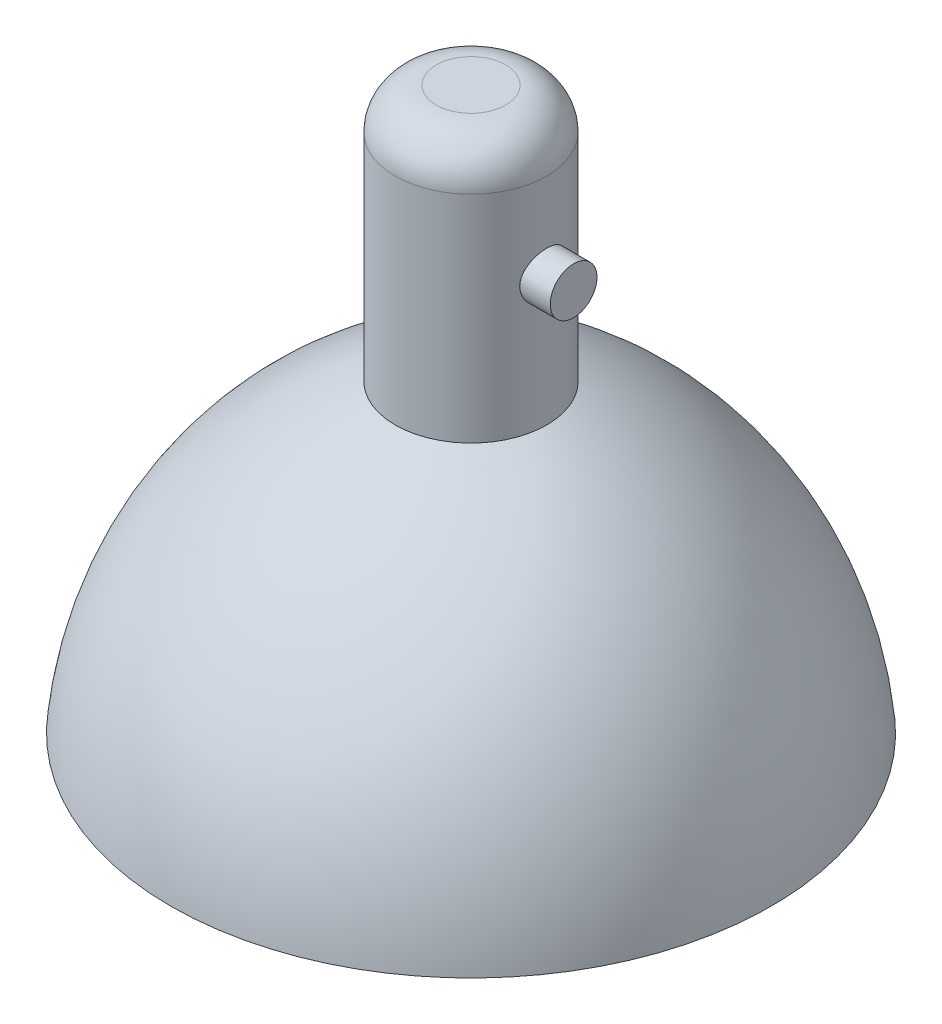
ISO-10303-21;
HEADER;
FILE_DESCRIPTION(('STEP AP214'),'2;1');
FILE_NAME('part.step','',(''),(''),'','','');
FILE_SCHEMA(('AUTOMOTIVE_DESIGN { 1 0 10303 214 1 1 1 1 }'));
ENDSEC;
DATA;
#1=APPLICATION_CONTEXT('core data for automotive mechanical design processes');
#2=APPLICATION_PROTOCOL_DEFINITION('international standard','automotive_design',2000,#1);
#3=PRODUCT_CONTEXT('',#1,'mechanical');
#4=PRODUCT('Part','Part','',(#3));
#5=PRODUCT_RELATED_PRODUCT_CATEGORY('part','',(#4));
#6=PRODUCT_DEFINITION_FORMATION('','',#4);
#7=PRODUCT_DEFINITION_CONTEXT('part definition',#1,'design');
#8=PRODUCT_DEFINITION('design','',#6,#7);
#9=PRODUCT_DEFINITION_SHAPE('','',#8);
#10=(LENGTH_UNIT() NAMED_UNIT(*) SI_UNIT(.MILLI.,.METRE.));
#11=(NAMED_UNIT(*) PLANE_ANGLE_UNIT() SI_UNIT($,.RADIAN.));
#12=(NAMED_UNIT(*) SI_UNIT($,.STERADIAN.) SOLID_ANGLE_UNIT());
#13=UNCERTAINTY_MEASURE_WITH_UNIT(LENGTH_MEASURE(1.E-05),#10,'distance_accuracy_value','');
#14=(GEOMETRIC_REPRESENTATION_CONTEXT(3) GLOBAL_UNCERTAINTY_ASSIGNED_CONTEXT((#13)) GLOBAL_UNIT_ASSIGNED_CONTEXT((#10,
#11,#12)) REPRESENTATION_CONTEXT('',''));
#15=CARTESIAN_POINT('',(0.,0.,0.));
#16=DIRECTION('',(0.,0.,1.));
#17=DIRECTION('',(1.,0.,0.));
#18=AXIS2_PLACEMENT_3D('',#15,#16,#17);
#19=CARTESIAN_POINT('',(0.,54.6759675547388,0.));
#20=DIRECTION('',(0.,-1.,0.));
#21=DIRECTION('',(0.,0.,-1.));
#22=AXIS2_PLACEMENT_3D('',#19,#20,#21);
#23=CYLINDRICAL_SURFACE('',#22,7.38529786260853);
#24=CARTESIAN_POINT('',(0.,50.6759675547388,0.));
#25=DIRECTION('',(0.,1.,0.));
#26=DIRECTION('',(0.,0.,1.));
#27=AXIS2_PLACEMENT_3D('',#24,#25,#26);
#28=CIRCLE('',#27,7.38529786260853);
#29=CARTESIAN_POINT('',(0.,50.6759675547388,7.38529786260853));
#30=VERTEX_POINT('',#29);
#31=EDGE_CURVE('E50',#30,#30,#28,.F.);
#32=ORIENTED_EDGE('',*,*,#31,.T.);
#33=EDGE_LOOP('',(#32));
#34=FACE_BOUND('',#33,.T.);
#35=CARTESIAN_POINT('',(0.,29.6759675547388,0.));
#36=DIRECTION('',(0.,1.,0.));
#37=DIRECTION('',(0.,0.,1.));
#38=AXIS2_PLACEMENT_3D('',#35,#36,#37);
#39=CIRCLE('',#38,7.38529786260853);
#40=CARTESIAN_POINT('',(0.,29.6759675547388,7.38529786260853));
#41=VERTEX_POINT('',#40);
#42=EDGE_CURVE('E71',#41,#41,#39,.T.);
#43=ORIENTED_EDGE('',*,*,#42,.T.);
#44=EDGE_LOOP('',(#43));
#45=FACE_BOUND('',#44,.T.);
#46=CARTESIAN_POINT('',(7.02529154065876,42.3153253212094,2.27769692632679));
#47=CARTESIAN_POINT('',(7.02529249307884,42.1906964600661,2.27769584003234));
#48=CARTESIAN_POINT('',(7.02864420684463,42.0660567736508,2.26743319134466));
#49=CARTESIAN_POINT('',(7.04163155234802,41.820433249435,2.22676730826925));
#50=CARTESIAN_POINT('',(7.05126901359609,41.6994504867381,2.19635821007672));
#51=CARTESIAN_POINT('',(7.07563473496744,41.4647334604111,2.11653972693149));
#52=CARTESIAN_POINT('',(7.09035416261902,41.3509870235713,2.06716329060672));
#53=CARTESIAN_POINT('',(7.12321314218842,41.1333620073075,1.9509211470018));
#54=CARTESIAN_POINT('',(7.14135326809307,41.0294850883758,1.88405250383141));
#55=CARTESIAN_POINT('',(7.17969034858651,40.8310726619195,1.73232861105308));
#56=CARTESIAN_POINT('',(7.19993299643461,40.7369159861496,1.64698938575516));
#57=CARTESIAN_POINT('',(7.23980497837883,40.5639977507854,1.46178292719813));
#58=CARTESIAN_POINT('',(7.25943422882912,40.4852382831984,1.36191372297218));
#59=CARTESIAN_POINT('',(7.29638919587495,40.3436873040599,1.14776897511424));
#60=CARTESIAN_POINT('',(7.31365482555179,40.2812846463807,1.03322511772235));
#61=CARTESIAN_POINT('',(7.34340449292231,40.1767765206975,0.794645290109409));
#62=CARTESIAN_POINT('',(7.35588962354597,40.1346664127886,0.670611497291362));
#63=CARTESIAN_POINT('',(7.37434817010741,40.0731999112992,0.420538145242259));
#64=CARTESIAN_POINT('',(7.38050641088676,40.0531963131506,0.29467155568746));
#65=CARTESIAN_POINT('',(7.38626945636775,40.0344614186492,0.0412280875430184));
#66=CARTESIAN_POINT('',(7.38587571321481,40.0357254086667,-0.0863484058100515));
#67=CARTESIAN_POINT('',(7.37870849528778,40.0590611814491,-0.335040002476932));
#68=CARTESIAN_POINT('',(7.372150065099,40.0804316091325,-0.456228100086667));
#69=CARTESIAN_POINT('',(7.35365383293992,40.14222453281,-0.693205515684735));
#70=CARTESIAN_POINT('',(7.34171568331049,40.1826482601129,-0.808994484225888));
#71=CARTESIAN_POINT('',(7.31350987159478,40.2818589312729,-1.03352122719463));
#72=CARTESIAN_POINT('',(7.29719177586676,40.3408612670583,-1.142157230491));
#73=CARTESIAN_POINT('',(7.26194920696148,40.4753823143304,-1.34820658421934));
#74=CARTESIAN_POINT('',(7.24302408837501,40.5509051184477,-1.44561714461629));
#75=CARTESIAN_POINT('',(7.20367771982453,40.7199363162478,-1.63063380830203));
#76=CARTESIAN_POINT('',(7.18322692404642,40.8140509262846,-1.71768055003003));
#77=CARTESIAN_POINT('',(7.14380079083582,41.0157358826812,-1.87491947495823));
#78=CARTESIAN_POINT('',(7.12482561807302,41.1233077272944,-1.94510977891215));
#79=CARTESIAN_POINT('',(7.0903526945539,41.3503982190635,-2.06727161481833));
#80=CARTESIAN_POINT('',(7.07489409171803,41.4700318019796,-2.11904135292898));
#81=CARTESIAN_POINT('',(7.04966546471577,41.7169091179263,-2.20152752153833));
#82=CARTESIAN_POINT('',(7.03989345973987,41.8441501839952,-2.23225128363161));
#83=CARTESIAN_POINT('',(7.02758249874553,42.0972831296647,-2.27070537448217));
#84=CARTESIAN_POINT('',(7.02477491162088,42.2230322246986,-2.27929018982539));
#85=CARTESIAN_POINT('',(7.02596583445491,42.4741810987061,-2.27561733544798));
#86=CARTESIAN_POINT('',(7.02996332602363,42.599580927135,-2.26336278436929));
#87=CARTESIAN_POINT('',(7.04404928730057,42.8428310837505,-2.21912183914956));
#88=CARTESIAN_POINT('',(7.05396452169051,42.960794446614,-2.18769610177057));
#89=CARTESIAN_POINT('',(7.0785865712683,43.1897625933181,-2.1066603922306));
#90=CARTESIAN_POINT('',(7.09329415434922,43.3007662585834,-2.05704750572628));
#91=CARTESIAN_POINT('',(7.12635660614136,43.5161122749687,-1.93945501416165));
#92=CARTESIAN_POINT('',(7.14480228552667,43.6201800897949,-1.87099883699255));
#93=CARTESIAN_POINT('',(7.18307223250474,43.8156627541904,-1.71822250875068));
#94=CARTESIAN_POINT('',(7.20289684812427,43.9070743919578,-1.63389834356495));
#95=CARTESIAN_POINT('',(7.24265552453946,44.0784399103859,-1.44774527665044));
#96=CARTESIAN_POINT('',(7.26256193585251,44.1577853147712,-1.34534887044727));
#97=CARTESIAN_POINT('',(7.29944265879467,44.298187913574,-1.1282154135072));
#98=CARTESIAN_POINT('',(7.31641710892722,44.3592459719708,-1.01347894612043));
#99=CARTESIAN_POINT('',(7.3454219311552,44.4607529608155,-0.775647957541509));
#100=CARTESIAN_POINT('',(7.35748841455275,44.5013529644396,-0.652622544579415));
#101=CARTESIAN_POINT('',(7.37547683333598,44.5611573396215,-0.401053448981468));
#102=CARTESIAN_POINT('',(7.38140063657857,44.5803682152842,-0.272511456207292));
#103=CARTESIAN_POINT('',(7.386315802389,44.5963317460522,-0.0191663639091554));
#104=CARTESIAN_POINT('',(7.38557883009145,44.5939644497268,0.105576679645744));
#105=CARTESIAN_POINT('',(7.37790251040515,44.5689589521237,0.352808297378413));
#106=CARTESIAN_POINT('',(7.37096354963544,44.546322014413,0.475297011600617));
#107=CARTESIAN_POINT('',(7.35174609611525,44.4819751297459,0.713113869462819));
#108=CARTESIAN_POINT('',(7.33953216690935,44.440495501464,0.828509909484143));
#109=CARTESIAN_POINT('',(7.31102535495407,44.3398479936334,1.05076185999048));
#110=CARTESIAN_POINT('',(7.29473178174909,44.2806771196167,1.15761632082115));
#111=CARTESIAN_POINT('',(7.25909480870986,44.1440462119351,1.36362186603128));
#112=CARTESIAN_POINT('',(7.23966792370015,44.0660428090413,1.46239798543201));
#113=CARTESIAN_POINT('',(7.20020411331463,43.8949260634628,1.64575156742207));
#114=CARTESIAN_POINT('',(7.18016700911959,43.801808256344,1.73032481976007));
#115=CARTESIAN_POINT('',(7.14099182680718,43.5995307794219,1.88560035648819));
#116=CARTESIAN_POINT('',(7.12190307652009,43.489952933208,1.95577180447534));
#117=CARTESIAN_POINT('',(7.08761098699788,43.2599912220445,2.07662303880084));
#118=CARTESIAN_POINT('',(7.07240597764598,43.1396120321695,2.12731120824189));
#119=CARTESIAN_POINT('',(7.0489348299675,42.9029565125393,2.20376790886073));
#120=CARTESIAN_POINT('',(7.04015594831455,42.7873350574818,2.23141155677928));
#121=CARTESIAN_POINT('',(7.0283345104581,42.5529202962027,2.26837447254277));
#122=CARTESIAN_POINT('',(7.02529063276476,42.4341277270856,2.2776979618365));
#123=CARTESIAN_POINT('',(7.02529154065876,42.3153253212094,2.27769692632679));
#124=B_SPLINE_CURVE_WITH_KNOTS('',3,(#46,#47,#48,#49,#50,#51,#52,#53,#54,#55,#56,#57,#58,#59,
#60,#61,#62,#63,#64,#65,#66,#67,#68,#69,#70,#71,#72,#73,#74,#75,#76,#77,#78,#79,#80,#81,#82,#83,
#84,#85,#86,#87,#88,#89,#90,#91,#92,#93,#94,#95,#96,#97,#98,#99,#100,#101,#102,#103,#104,#105,
#106,#107,#108,#109,#110,#111,#112,#113,#114,#115,#116,#117,#118,#119,#120,#121,#122,#123),
.UNSPECIFIED.,.T.,.F.,(4,2,2,2,2,2,2,2,2,2,2,2,2,2,2,2,2,2,2,2,2,2,2,2,2,2,2,2,2,2,2,2,2,2,2,2,
2,2,4),(0.,0.373447935246336,0.747004613644126,1.11991529081379,1.49288859747701,
1.87717297909003,2.26150953690873,2.65429040781434,3.04698142645323,3.4278433176196,
3.80862079779046,4.17658982495804,4.54458263517661,4.91700943698326,5.28952860511405,
5.67718746107393,6.06488951528448,6.45671671721361,6.84840735236586,7.2247369525489,
7.60101023940807,7.96677445673209,8.33259731044791,8.70869138369367,9.0848807253835,
9.4761958703761,9.86749252490224,10.2558556619353,10.6441006714309,11.0165845822471,
11.3890452748121,11.7570709456542,12.1251589448147,12.5055030995051,12.8859598039071,
13.2785982725879,13.671067610441,14.0271387447126,14.3831278211571),.UNSPECIFIED.);
#125=CARTESIAN_POINT('',(7.02529154065876,42.3153253212094,2.27769692632679));
#126=VERTEX_POINT('',#125);
#127=EDGE_CURVE('E10',#126,#126,#124,.T.);
#128=ORIENTED_EDGE('',*,*,#127,.F.);
#129=EDGE_LOOP('',(#128));
#130=FACE_BOUND('',#129,.T.);
#131=ADVANCED_FACE('F37',(#34,#45,#130),#23,.T.);
#132=CARTESIAN_POINT('',(0.,-3.28962228749227,0.));
#133=DIRECTION('',(0.,-1.,0.));
#134=DIRECTION('',(0.,0.,-1.));
#135=AXIS2_PLACEMENT_3D('',#132,#133,#134);
#136=DEGENERATE_TOROIDAL_SURFACE('',#135,6.28064163938249,35.6859638530093,.F.);
#137=ORIENTED_EDGE('',*,*,#42,.F.);
#138=EDGE_LOOP('',(#137));
#139=FACE_BOUND('',#138,.T.);
#140=CARTESIAN_POINT('',(0.,0.,0.));
#141=DIRECTION('',(0.,-1.,0.));
#142=DIRECTION('',(0.,0.,-1.));
#143=AXIS2_PLACEMENT_3D('',#140,#141,#142);
#144=CIRCLE('',#143,29.2533758836041);
#145=CARTESIAN_POINT('',(0.,0.,-29.2533758836041));
#146=VERTEX_POINT('',#145);
#147=EDGE_CURVE('E60',#146,#146,#144,.T.);
#148=ORIENTED_EDGE('',*,*,#147,.F.);
#149=EDGE_LOOP('',(#148));
#150=FACE_BOUND('',#149,.T.);
#151=ADVANCED_FACE('F97',(#139,#150),#136,.F.);
#152=CARTESIAN_POINT('',(0.,0.,0.));
#153=DIRECTION('',(0.,-1.,0.));
#154=DIRECTION('',(0.,0.,-1.));
#155=AXIS2_PLACEMENT_3D('',#152,#153,#154);
#156=PLANE('',#155);
#157=CARTESIAN_POINT('',(0.,0.,0.));
#158=DIRECTION('',(0.,-1.,0.));
#159=DIRECTION('',(0.,0.,-1.));
#160=AXIS2_PLACEMENT_3D('',#157,#158,#159);
#161=CIRCLE('',#160,27.2443124383174);
#162=CARTESIAN_POINT('',(0.,0.,-27.2443124383174));
#163=VERTEX_POINT('',#162);
#164=EDGE_CURVE('E67',#163,#163,#161,.T.);
#165=ORIENTED_EDGE('',*,*,#164,.F.);
#166=EDGE_LOOP('',(#165));
#167=FACE_BOUND('',#166,.T.);
#168=ORIENTED_EDGE('',*,*,#147,.T.);
#169=EDGE_LOOP('',(#168));
#170=FACE_BOUND('',#169,.T.);
#171=ADVANCED_FACE('F101',(#167,#170),#156,.T.);
#172=CARTESIAN_POINT('',(0.,27.6759675547388,0.));
#173=DIRECTION('',(0.,1.,0.));
#174=DIRECTION('',(0.,0.,1.));
#175=AXIS2_PLACEMENT_3D('',#172,#173,#174);
#176=PLANE('',#175);
#177=CARTESIAN_POINT('',(0.,27.6759675547388,0.));
#178=DIRECTION('',(0.,1.,0.));
#179=DIRECTION('',(0.,0.,1.));
#180=AXIS2_PLACEMENT_3D('',#177,#178,#179);
#181=CIRCLE('',#180,6.98119859600587);
#182=CARTESIAN_POINT('',(0.,27.6759675547388,6.98119859600587));
#183=VERTEX_POINT('',#182);
#184=EDGE_CURVE('E66',#183,#183,#181,.F.);
#185=ORIENTED_EDGE('',*,*,#184,.T.);
#186=EDGE_LOOP('',(#185));
#187=FACE_BOUND('',#186,.T.);
#188=ADVANCED_FACE('F106',(#187),#176,.F.);
#189=CARTESIAN_POINT('',(0.,-3.28962228749227,0.));
#190=DIRECTION('',(0.,-1.,0.));
#191=DIRECTION('',(0.,0.,-1.));
#192=AXIS2_PLACEMENT_3D('',#189,#190,#191);
#193=DEGENERATE_TOROIDAL_SURFACE('',#192,6.28064163938249,33.6859638530093,.F.);
#194=ORIENTED_EDGE('',*,*,#184,.F.);
#195=EDGE_LOOP('',(#194));
#196=FACE_BOUND('',#195,.T.);
#197=ORIENTED_EDGE('',*,*,#164,.T.);
#198=EDGE_LOOP('',(#197));
#199=FACE_BOUND('',#198,.T.);
#200=ADVANCED_FACE('F109',(#196,#199),#193,.T.);
#201=CARTESIAN_POINT('',(0.,54.6759675547388,0.));
#202=DIRECTION('',(0.,1.,0.));
#203=DIRECTION('',(0.,0.,1.));
#204=AXIS2_PLACEMENT_3D('',#201,#202,#203);
#205=PLANE('',#204);
#206=CARTESIAN_POINT('',(0.,54.6759675547388,0.));
#207=DIRECTION('',(0.,1.,0.));
#208=DIRECTION('',(0.,0.,1.));
#209=AXIS2_PLACEMENT_3D('',#206,#207,#208);
#210=CIRCLE('',#209,3.38529786260853);
#211=CARTESIAN_POINT('',(0.,54.6759675547388,3.38529786260853));
#212=VERTEX_POINT('',#211);
#213=EDGE_CURVE('E55',#212,#212,#210,.T.);
#214=ORIENTED_EDGE('',*,*,#213,.T.);
#215=EDGE_LOOP('',(#214));
#216=FACE_BOUND('',#215,.T.);
#217=ADVANCED_FACE('F92',(#216),#205,.T.);
#218=CARTESIAN_POINT('',(0.,50.6759675547388,0.));
#219=DIRECTION('',(0.,1.,0.));
#220=DIRECTION('',(0.,0.,1.));
#221=AXIS2_PLACEMENT_3D('',#218,#219,#220);
#222=DEGENERATE_TOROIDAL_SURFACE('',#221,3.38529786260853,4.,.T.);
#223=ORIENTED_EDGE('',*,*,#31,.F.);
#224=EDGE_LOOP('',(#223));
#225=FACE_BOUND('',#224,.T.);
#226=ORIENTED_EDGE('',*,*,#213,.F.);
#227=EDGE_LOOP('',(#226));
#228=FACE_BOUND('',#227,.T.);
#229=ADVANCED_FACE('F39',(#225,#228),#222,.T.);
#230=CARTESIAN_POINT('',(10.,42.3153253212094,0.));
#231=DIRECTION('',(-1.,0.,0.));
#232=DIRECTION('',(0.,0.,1.));
#233=AXIS2_PLACEMENT_3D('',#230,#231,#232);
#234=CYLINDRICAL_SURFACE('',#233,2.27769692632679);
#235=CARTESIAN_POINT('',(10.,42.3153253212094,0.));
#236=DIRECTION('',(1.,0.,0.));
#237=DIRECTION('',(0.,0.,-1.));
#238=AXIS2_PLACEMENT_3D('',#235,#236,#237);
#239=CIRCLE('',#238,2.27769692632679);
#240=CARTESIAN_POINT('',(10.,42.3153253212094,-2.27769692632679));
#241=VERTEX_POINT('',#240);
#242=EDGE_CURVE('E78',#241,#241,#239,.T.);
#243=ORIENTED_EDGE('',*,*,#242,.F.);
#244=EDGE_LOOP('',(#243));
#245=FACE_BOUND('',#244,.T.);
#246=ORIENTED_EDGE('',*,*,#127,.T.);
#247=EDGE_LOOP('',(#246));
#248=FACE_BOUND('',#247,.T.);
#249=ADVANCED_FACE('F85',(#245,#248),#234,.T.);
#250=CARTESIAN_POINT('',(10.,42.3153253212094,0.));
#251=DIRECTION('',(1.,0.,0.));
#252=DIRECTION('',(0.,0.,-1.));
#253=AXIS2_PLACEMENT_3D('',#250,#251,#252);
#254=PLANE('',#253);
#255=ORIENTED_EDGE('',*,*,#242,.T.);
#256=EDGE_LOOP('',(#255));
#257=FACE_BOUND('',#256,.T.);
#258=ADVANCED_FACE('F83',(#257),#254,.T.);
#259=CLOSED_SHELL('',(#131,#151,#171,#188,#200,#217,#229,#249,#258));
#260=MANIFOLD_SOLID_BREP('B2',#259);
#261=ADVANCED_BREP_SHAPE_REPRESENTATION('',(#18,#260),#14);
#262=SHAPE_DEFINITION_REPRESENTATION(#9,#261);
ENDSEC;
END-ISO-10303-21;
